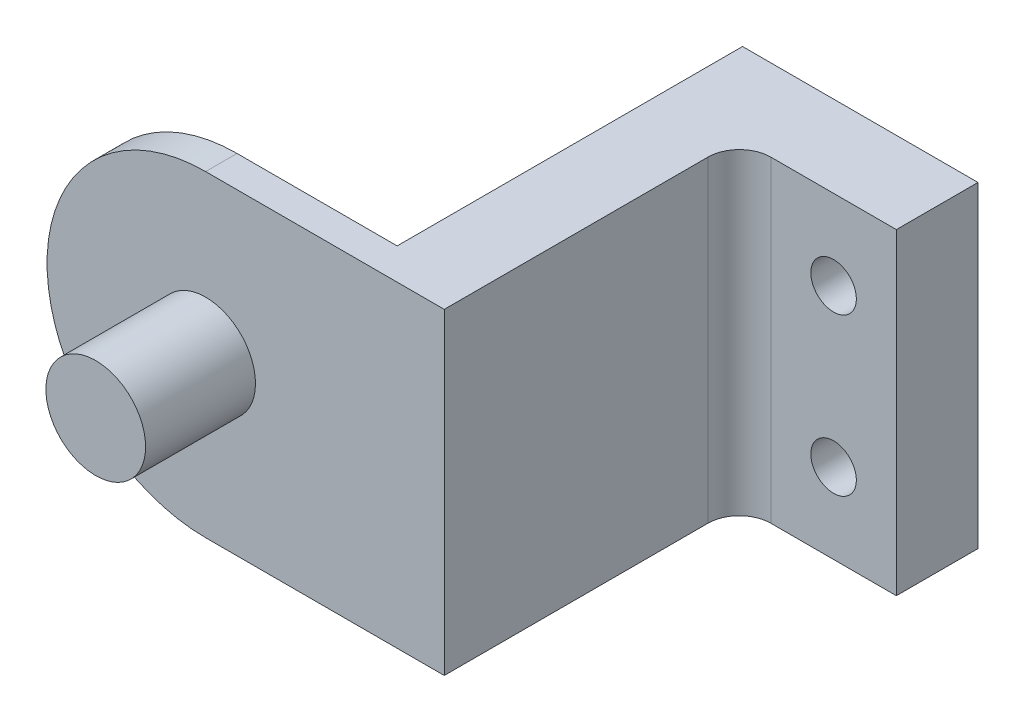
ISO-10303-21;
HEADER;
FILE_DESCRIPTION(('STEP AP214'),'2;1');
FILE_NAME('part.step','',(''),(''),'','','');
FILE_SCHEMA(('AUTOMOTIVE_DESIGN { 1 0 10303 214 1 1 1 1 }'));
ENDSEC;
DATA;
#1=APPLICATION_CONTEXT('core data for automotive mechanical design processes');
#2=APPLICATION_PROTOCOL_DEFINITION('international standard','automotive_design',2000,#1);
#3=PRODUCT_CONTEXT('',#1,'mechanical');
#4=PRODUCT('Part','Part','',(#3));
#5=PRODUCT_RELATED_PRODUCT_CATEGORY('part','',(#4));
#6=PRODUCT_DEFINITION_FORMATION('','',#4);
#7=PRODUCT_DEFINITION_CONTEXT('part definition',#1,'design');
#8=PRODUCT_DEFINITION('design','',#6,#7);
#9=PRODUCT_DEFINITION_SHAPE('','',#8);
#10=(LENGTH_UNIT() NAMED_UNIT(*) SI_UNIT(.MILLI.,.METRE.));
#11=(NAMED_UNIT(*) PLANE_ANGLE_UNIT() SI_UNIT($,.RADIAN.));
#12=(NAMED_UNIT(*) SI_UNIT($,.STERADIAN.) SOLID_ANGLE_UNIT());
#13=UNCERTAINTY_MEASURE_WITH_UNIT(LENGTH_MEASURE(1.E-05),#10,'distance_accuracy_value','');
#14=(GEOMETRIC_REPRESENTATION_CONTEXT(3) GLOBAL_UNCERTAINTY_ASSIGNED_CONTEXT((#13)) GLOBAL_UNIT_ASSIGNED_CONTEXT((#10,
#11,#12)) REPRESENTATION_CONTEXT('',''));
#15=CARTESIAN_POINT('',(0.,0.,0.));
#16=DIRECTION('',(0.,0.,1.));
#17=DIRECTION('',(1.,0.,0.));
#18=AXIS2_PLACEMENT_3D('',#15,#16,#17);
#19=CARTESIAN_POINT('',(2.5,10.1,22.));
#20=DIRECTION('',(-1.,0.,0.));
#21=DIRECTION('',(0.,-1.,0.));
#22=AXIS2_PLACEMENT_3D('',#19,#20,#21);
#23=PLANE('',#22);
#24=DIRECTION('',(0.,0.,-1.));
#25=VECTOR('',#24,1.);
#26=CARTESIAN_POINT('',(2.5,-10.1,22.));
#27=LINE('',#26,#25);
#28=CARTESIAN_POINT('',(2.5,-10.1,24.));
#29=VERTEX_POINT('',#28);
#30=CARTESIAN_POINT('',(2.5,-10.1,7.2));
#31=VERTEX_POINT('',#30);
#32=EDGE_CURVE('E197',#29,#31,#27,.T.);
#33=ORIENTED_EDGE('',*,*,#32,.T.);
#34=DIRECTION('',(0.,-1.,0.));
#35=VECTOR('',#34,1.);
#36=CARTESIAN_POINT('',(2.5,10.1,7.2));
#37=LINE('',#36,#35);
#38=CARTESIAN_POINT('',(2.5,10.1,7.2));
#39=VERTEX_POINT('',#38);
#40=EDGE_CURVE('E61',#31,#39,#37,.F.);
#41=ORIENTED_EDGE('',*,*,#40,.T.);
#42=DIRECTION('',(0.,0.,-1.));
#43=VECTOR('',#42,1.);
#44=CARTESIAN_POINT('',(2.5,10.1,22.));
#45=LINE('',#44,#43);
#46=CARTESIAN_POINT('',(2.5,10.1,24.));
#47=VERTEX_POINT('',#46);
#48=EDGE_CURVE('E213',#47,#39,#45,.T.);
#49=ORIENTED_EDGE('',*,*,#48,.F.);
#50=DIRECTION('',(0.,1.,0.));
#51=VECTOR('',#50,1.);
#52=CARTESIAN_POINT('',(2.5,10.1,24.));
#53=LINE('',#52,#51);
#54=EDGE_CURVE('E164',#29,#47,#53,.T.);
#55=ORIENTED_EDGE('',*,*,#54,.F.);
#56=EDGE_LOOP('',(#33,#41,#49,#55));
#57=FACE_BOUND('',#56,.T.);
#58=ADVANCED_FACE('F39',(#57),#23,.F.);
#59=CARTESIAN_POINT('',(-2.5,10.1,22.));
#60=DIRECTION('',(0.,-1.,0.));
#61=DIRECTION('',(0.,0.,-1.));
#62=AXIS2_PLACEMENT_3D('',#59,#60,#61);
#63=PLANE('',#62);
#64=DIRECTION('',(-1.,0.,0.));
#65=VECTOR('',#64,1.);
#66=CARTESIAN_POINT('',(-2.5,10.1,0.));
#67=LINE('',#66,#65);
#68=CARTESIAN_POINT('',(12.5,10.1,0.));
#69=VERTEX_POINT('',#68);
#70=CARTESIAN_POINT('',(-2.5,10.1,0.));
#71=VERTEX_POINT('',#70);
#72=EDGE_CURVE('E109',#69,#71,#67,.T.);
#73=ORIENTED_EDGE('',*,*,#72,.T.);
#74=DIRECTION('',(0.,0.,-1.));
#75=VECTOR('',#74,1.);
#76=CARTESIAN_POINT('',(-2.5,10.1,22.));
#77=LINE('',#76,#75);
#78=CARTESIAN_POINT('',(-2.5,10.1,22.));
#79=VERTEX_POINT('',#78);
#80=EDGE_CURVE('E210',#79,#71,#77,.T.);
#81=ORIENTED_EDGE('',*,*,#80,.F.);
#82=DIRECTION('',(-1.,0.,0.));
#83=VECTOR('',#82,1.);
#84=CARTESIAN_POINT('',(2.5,10.1,22.));
#85=LINE('',#84,#83);
#86=CARTESIAN_POINT('',(-12.7,10.1,22.));
#87=VERTEX_POINT('',#86);
#88=EDGE_CURVE('E160',#79,#87,#85,.T.);
#89=ORIENTED_EDGE('',*,*,#88,.T.);
#90=DIRECTION('',(0.,0.,-1.));
#91=VECTOR('',#90,1.);
#92=CARTESIAN_POINT('',(-12.7,10.1,24.));
#93=LINE('',#92,#91);
#94=CARTESIAN_POINT('',(-12.7,10.1,24.));
#95=VERTEX_POINT('',#94);
#96=EDGE_CURVE('E119',#95,#87,#93,.T.);
#97=ORIENTED_EDGE('',*,*,#96,.F.);
#98=DIRECTION('',(-1.,0.,0.));
#99=VECTOR('',#98,1.);
#100=CARTESIAN_POINT('',(2.5,10.1,24.));
#101=LINE('',#100,#99);
#102=EDGE_CURVE('E168',#47,#95,#101,.T.);
#103=ORIENTED_EDGE('',*,*,#102,.F.);
#104=ORIENTED_EDGE('',*,*,#48,.T.);
#105=CARTESIAN_POINT('',(4.5,10.1,7.2));
#106=DIRECTION('',(0.,-1.,0.));
#107=DIRECTION('',(0.,0.,-1.));
#108=AXIS2_PLACEMENT_3D('',#105,#106,#107);
#109=CIRCLE('',#108,2.);
#110=CARTESIAN_POINT('',(4.5,10.1,5.2));
#111=VERTEX_POINT('',#110);
#112=EDGE_CURVE('E11',#39,#111,#109,.T.);
#113=ORIENTED_EDGE('',*,*,#112,.T.);
#114=DIRECTION('',(-1.,0.,0.));
#115=VECTOR('',#114,1.);
#116=CARTESIAN_POINT('',(12.5,10.1,5.2));
#117=LINE('',#116,#115);
#118=CARTESIAN_POINT('',(12.5,10.1,5.2));
#119=VERTEX_POINT('',#118);
#120=EDGE_CURVE('E125',#119,#111,#117,.T.);
#121=ORIENTED_EDGE('',*,*,#120,.F.);
#122=DIRECTION('',(0.,0.,1.));
#123=VECTOR('',#122,1.);
#124=CARTESIAN_POINT('',(12.5,10.1,0.));
#125=LINE('',#124,#123);
#126=EDGE_CURVE('E122',#69,#119,#125,.T.);
#127=ORIENTED_EDGE('',*,*,#126,.F.);
#128=EDGE_LOOP('',(#73,#81,#89,#97,#103,#104,#113,#121,#127));
#129=FACE_BOUND('',#128,.T.);
#130=ADVANCED_FACE('F123',(#129),#63,.F.);
#131=CARTESIAN_POINT('',(-2.5,10.1,22.));
#132=DIRECTION('',(1.,0.,0.));
#133=DIRECTION('',(0.,1.,0.));
#134=AXIS2_PLACEMENT_3D('',#131,#132,#133);
#135=PLANE('',#134);
#136=DIRECTION('',(0.,-1.,0.));
#137=VECTOR('',#136,1.);
#138=CARTESIAN_POINT('',(-2.5,10.1,0.));
#139=LINE('',#138,#137);
#140=CARTESIAN_POINT('',(-2.5,-10.1,0.));
#141=VERTEX_POINT('',#140);
#142=EDGE_CURVE('E115',#71,#141,#139,.T.);
#143=ORIENTED_EDGE('',*,*,#142,.T.);
#144=DIRECTION('',(0.,0.,-1.));
#145=VECTOR('',#144,1.);
#146=CARTESIAN_POINT('',(-2.5,-10.1,22.));
#147=LINE('',#146,#145);
#148=CARTESIAN_POINT('',(-2.5,-10.1,22.));
#149=VERTEX_POINT('',#148);
#150=EDGE_CURVE('E206',#149,#141,#147,.T.);
#151=ORIENTED_EDGE('',*,*,#150,.F.);
#152=DIRECTION('',(0.,-1.,0.));
#153=VECTOR('',#152,1.);
#154=CARTESIAN_POINT('',(-2.5,10.1,22.));
#155=LINE('',#154,#153);
#156=EDGE_CURVE('E194',#79,#149,#155,.T.);
#157=ORIENTED_EDGE('',*,*,#156,.F.);
#158=ORIENTED_EDGE('',*,*,#80,.T.);
#159=EDGE_LOOP('',(#143,#151,#157,#158));
#160=FACE_BOUND('',#159,.T.);
#161=ADVANCED_FACE('F236',(#160),#135,.F.);
#162=CARTESIAN_POINT('',(-2.5,-10.1,22.));
#163=DIRECTION('',(0.,1.,0.));
#164=DIRECTION('',(0.,0.,1.));
#165=AXIS2_PLACEMENT_3D('',#162,#163,#164);
#166=PLANE('',#165);
#167=DIRECTION('',(1.,0.,0.));
#168=VECTOR('',#167,1.);
#169=CARTESIAN_POINT('',(-2.5,-10.1,0.));
#170=LINE('',#169,#168);
#171=CARTESIAN_POINT('',(12.5,-10.1,0.));
#172=VERTEX_POINT('',#171);
#173=EDGE_CURVE('E198',#141,#172,#170,.T.);
#174=ORIENTED_EDGE('',*,*,#173,.T.);
#175=DIRECTION('',(0.,0.,-1.));
#176=VECTOR('',#175,1.);
#177=CARTESIAN_POINT('',(12.5,-10.1,0.));
#178=LINE('',#177,#176);
#179=CARTESIAN_POINT('',(12.5,-10.1,5.2));
#180=VERTEX_POINT('',#179);
#181=EDGE_CURVE('E134',#180,#172,#178,.T.);
#182=ORIENTED_EDGE('',*,*,#181,.F.);
#183=DIRECTION('',(-1.,0.,0.));
#184=VECTOR('',#183,1.);
#185=CARTESIAN_POINT('',(12.5,-10.1,5.2));
#186=LINE('',#185,#184);
#187=CARTESIAN_POINT('',(4.5,-10.1,5.2));
#188=VERTEX_POINT('',#187);
#189=EDGE_CURVE('E150',#180,#188,#186,.T.);
#190=ORIENTED_EDGE('',*,*,#189,.T.);
#191=CARTESIAN_POINT('',(4.5,-10.1,7.2));
#192=DIRECTION('',(0.,1.,0.));
#193=DIRECTION('',(0.,0.,1.));
#194=AXIS2_PLACEMENT_3D('',#191,#192,#193);
#195=CIRCLE('',#194,2.);
#196=EDGE_CURVE('E48',#188,#31,#195,.T.);
#197=ORIENTED_EDGE('',*,*,#196,.T.);
#198=ORIENTED_EDGE('',*,*,#32,.F.);
#199=DIRECTION('',(1.,0.,0.));
#200=VECTOR('',#199,1.);
#201=CARTESIAN_POINT('',(2.5,-10.1,24.));
#202=LINE('',#201,#200);
#203=CARTESIAN_POINT('',(-12.7,-10.1,24.));
#204=VERTEX_POINT('',#203);
#205=EDGE_CURVE('E175',#204,#29,#202,.T.);
#206=ORIENTED_EDGE('',*,*,#205,.F.);
#207=DIRECTION('',(0.,0.,-1.));
#208=VECTOR('',#207,1.);
#209=CARTESIAN_POINT('',(-12.7,-10.1,24.));
#210=LINE('',#209,#208);
#211=CARTESIAN_POINT('',(-12.7,-10.1,22.));
#212=VERTEX_POINT('',#211);
#213=EDGE_CURVE('E179',#204,#212,#210,.T.);
#214=ORIENTED_EDGE('',*,*,#213,.T.);
#215=DIRECTION('',(1.,0.,0.));
#216=VECTOR('',#215,1.);
#217=CARTESIAN_POINT('',(2.5,-10.1,22.));
#218=LINE('',#217,#216);
#219=EDGE_CURVE('E169',#212,#149,#218,.T.);
#220=ORIENTED_EDGE('',*,*,#219,.T.);
#221=ORIENTED_EDGE('',*,*,#150,.T.);
#222=EDGE_LOOP('',(#174,#182,#190,#197,#198,#206,#214,#220,#221));
#223=FACE_BOUND('',#222,.T.);
#224=ADVANCED_FACE('F232',(#223),#166,.F.);
#225=CARTESIAN_POINT('',(0.,0.,0.));
#226=DIRECTION('',(0.,0.,1.));
#227=DIRECTION('',(1.,0.,0.));
#228=AXIS2_PLACEMENT_3D('',#225,#226,#227);
#229=PLANE('',#228);
#230=CARTESIAN_POINT('',(8.50000000000002,-5.,0.));
#231=DIRECTION('',(0.,0.,-1.));
#232=DIRECTION('',(-1.,0.,0.));
#233=AXIS2_PLACEMENT_3D('',#230,#231,#232);
#234=CIRCLE('',#233,1.45);
#235=CARTESIAN_POINT('',(7.05000000000002,-5.,0.));
#236=VERTEX_POINT('',#235);
#237=EDGE_CURVE('E219',#236,#236,#234,.T.);
#238=ORIENTED_EDGE('',*,*,#237,.F.);
#239=EDGE_LOOP('',(#238));
#240=FACE_BOUND('',#239,.T.);
#241=CARTESIAN_POINT('',(8.50000000000005,5.,0.));
#242=DIRECTION('',(0.,0.,-1.));
#243=DIRECTION('',(-1.,0.,0.));
#244=AXIS2_PLACEMENT_3D('',#241,#242,#243);
#245=CIRCLE('',#244,1.45);
#246=CARTESIAN_POINT('',(7.05000000000005,5.,0.));
#247=VERTEX_POINT('',#246);
#248=EDGE_CURVE('E143',#247,#247,#245,.T.);
#249=ORIENTED_EDGE('',*,*,#248,.F.);
#250=EDGE_LOOP('',(#249));
#251=FACE_BOUND('',#250,.T.);
#252=ORIENTED_EDGE('',*,*,#72,.F.);
#253=DIRECTION('',(0.,1.,0.));
#254=VECTOR('',#253,1.);
#255=CARTESIAN_POINT('',(12.5,-10.1,0.));
#256=LINE('',#255,#254);
#257=EDGE_CURVE('E114',#172,#69,#256,.T.);
#258=ORIENTED_EDGE('',*,*,#257,.F.);
#259=ORIENTED_EDGE('',*,*,#173,.F.);
#260=ORIENTED_EDGE('',*,*,#142,.F.);
#261=EDGE_LOOP('',(#252,#258,#259,#260));
#262=FACE_BOUND('',#261,.T.);
#263=ADVANCED_FACE('F111',(#240,#251,#262),#229,.F.);
#264=CARTESIAN_POINT('',(-12.7,0.,22.));
#265=DIRECTION('',(0.,0.,1.));
#266=DIRECTION('',(1.,0.,0.));
#267=AXIS2_PLACEMENT_3D('',#264,#265,#266);
#268=PLANE('',#267);
#269=ORIENTED_EDGE('',*,*,#88,.F.);
#270=ORIENTED_EDGE('',*,*,#156,.T.);
#271=ORIENTED_EDGE('',*,*,#219,.F.);
#272=CARTESIAN_POINT('',(-12.7,0.,22.));
#273=DIRECTION('',(0.,0.,1.));
#274=DIRECTION('',(1.,0.,0.));
#275=AXIS2_PLACEMENT_3D('',#272,#273,#274);
#276=CIRCLE('',#275,10.1);
#277=EDGE_CURVE('E182',#87,#212,#276,.T.);
#278=ORIENTED_EDGE('',*,*,#277,.F.);
#279=EDGE_LOOP('',(#269,#270,#271,#278));
#280=FACE_BOUND('',#279,.T.);
#281=ADVANCED_FACE('F239',(#280),#268,.F.);
#282=CARTESIAN_POINT('',(-12.7,0.,24.));
#283=DIRECTION('',(0.,0.,-1.));
#284=DIRECTION('',(-1.,0.,0.));
#285=AXIS2_PLACEMENT_3D('',#282,#283,#284);
#286=CYLINDRICAL_SURFACE('',#285,10.1);
#287=ORIENTED_EDGE('',*,*,#277,.T.);
#288=ORIENTED_EDGE('',*,*,#213,.F.);
#289=CARTESIAN_POINT('',(-12.7,0.,24.));
#290=DIRECTION('',(0.,0.,1.));
#291=DIRECTION('',(1.,0.,0.));
#292=AXIS2_PLACEMENT_3D('',#289,#290,#291);
#293=CIRCLE('',#292,10.1);
#294=EDGE_CURVE('E172',#95,#204,#293,.T.);
#295=ORIENTED_EDGE('',*,*,#294,.F.);
#296=ORIENTED_EDGE('',*,*,#96,.T.);
#297=EDGE_LOOP('',(#287,#288,#295,#296));
#298=FACE_BOUND('',#297,.T.);
#299=ADVANCED_FACE('F245',(#298),#286,.T.);
#300=CARTESIAN_POINT('',(-12.7,0.,24.));
#301=DIRECTION('',(0.,0.,1.));
#302=DIRECTION('',(1.,0.,0.));
#303=AXIS2_PLACEMENT_3D('',#300,#301,#302);
#304=PLANE('',#303);
#305=CARTESIAN_POINT('',(-12.7,0.,24.));
#306=DIRECTION('',(0.,0.,1.));
#307=DIRECTION('',(1.,0.,0.));
#308=AXIS2_PLACEMENT_3D('',#305,#306,#307);
#309=CIRCLE('',#308,3.175);
#310=CARTESIAN_POINT('',(-9.525,0.,24.));
#311=VERTEX_POINT('',#310);
#312=EDGE_CURVE('E155',#311,#311,#309,.T.);
#313=ORIENTED_EDGE('',*,*,#312,.F.);
#314=EDGE_LOOP('',(#313));
#315=FACE_BOUND('',#314,.T.);
#316=ORIENTED_EDGE('',*,*,#54,.T.);
#317=ORIENTED_EDGE('',*,*,#102,.T.);
#318=ORIENTED_EDGE('',*,*,#294,.T.);
#319=ORIENTED_EDGE('',*,*,#205,.T.);
#320=EDGE_LOOP('',(#316,#317,#318,#319));
#321=FACE_BOUND('',#320,.T.);
#322=ADVANCED_FACE('F249',(#315,#321),#304,.T.);
#323=CARTESIAN_POINT('',(-12.7,0.,31.));
#324=DIRECTION('',(0.,0.,-1.));
#325=DIRECTION('',(-1.,0.,0.));
#326=AXIS2_PLACEMENT_3D('',#323,#324,#325);
#327=CYLINDRICAL_SURFACE('',#326,3.175);
#328=CARTESIAN_POINT('',(-12.7,0.,31.));
#329=DIRECTION('',(0.,0.,1.));
#330=DIRECTION('',(1.,0.,0.));
#331=AXIS2_PLACEMENT_3D('',#328,#329,#330);
#332=CIRCLE('',#331,3.175);
#333=CARTESIAN_POINT('',(-9.525,0.,31.));
#334=VERTEX_POINT('',#333);
#335=EDGE_CURVE('E156',#334,#334,#332,.T.);
#336=ORIENTED_EDGE('',*,*,#335,.F.);
#337=EDGE_LOOP('',(#336));
#338=FACE_BOUND('',#337,.T.);
#339=ORIENTED_EDGE('',*,*,#312,.T.);
#340=EDGE_LOOP('',(#339));
#341=FACE_BOUND('',#340,.T.);
#342=ADVANCED_FACE('F278',(#338,#341),#327,.T.);
#343=CARTESIAN_POINT('',(-12.7,0.,31.));
#344=DIRECTION('',(0.,0.,1.));
#345=DIRECTION('',(1.,0.,0.));
#346=AXIS2_PLACEMENT_3D('',#343,#344,#345);
#347=PLANE('',#346);
#348=ORIENTED_EDGE('',*,*,#335,.T.);
#349=EDGE_LOOP('',(#348));
#350=FACE_BOUND('',#349,.T.);
#351=ADVANCED_FACE('F282',(#350),#347,.T.);
#352=CARTESIAN_POINT('',(12.5,-10.1,5.2));
#353=DIRECTION('',(0.,0.,-1.));
#354=DIRECTION('',(-1.,0.,0.));
#355=AXIS2_PLACEMENT_3D('',#352,#353,#354);
#356=PLANE('',#355);
#357=CARTESIAN_POINT('',(8.50000000000002,-5.,5.2));
#358=DIRECTION('',(0.,0.,-1.));
#359=DIRECTION('',(-1.,0.,0.));
#360=AXIS2_PLACEMENT_3D('',#357,#358,#359);
#361=CIRCLE('',#360,1.45);
#362=CARTESIAN_POINT('',(7.05000000000002,-5.,5.2));
#363=VERTEX_POINT('',#362);
#364=EDGE_CURVE('E136',#363,#363,#361,.T.);
#365=ORIENTED_EDGE('',*,*,#364,.T.);
#366=EDGE_LOOP('',(#365));
#367=FACE_BOUND('',#366,.T.);
#368=CARTESIAN_POINT('',(8.50000000000005,5.,5.2));
#369=DIRECTION('',(0.,0.,-1.));
#370=DIRECTION('',(-1.,0.,0.));
#371=AXIS2_PLACEMENT_3D('',#368,#369,#370);
#372=CIRCLE('',#371,1.45);
#373=CARTESIAN_POINT('',(7.05000000000005,5.,5.2));
#374=VERTEX_POINT('',#373);
#375=EDGE_CURVE('E140',#374,#374,#372,.T.);
#376=ORIENTED_EDGE('',*,*,#375,.T.);
#377=EDGE_LOOP('',(#376));
#378=FACE_BOUND('',#377,.T.);
#379=ORIENTED_EDGE('',*,*,#120,.T.);
#380=DIRECTION('',(0.,-1.,0.));
#381=VECTOR('',#380,1.);
#382=CARTESIAN_POINT('',(4.5,-10.1,5.2));
#383=LINE('',#382,#381);
#384=EDGE_CURVE('E216',#111,#188,#383,.T.);
#385=ORIENTED_EDGE('',*,*,#384,.T.);
#386=ORIENTED_EDGE('',*,*,#189,.F.);
#387=DIRECTION('',(0.,-1.,0.));
#388=VECTOR('',#387,1.);
#389=CARTESIAN_POINT('',(12.5,-10.1,5.2));
#390=LINE('',#389,#388);
#391=EDGE_CURVE('E129',#119,#180,#390,.T.);
#392=ORIENTED_EDGE('',*,*,#391,.F.);
#393=EDGE_LOOP('',(#379,#385,#386,#392));
#394=FACE_BOUND('',#393,.T.);
#395=ADVANCED_FACE('F229',(#367,#378,#394),#356,.F.);
#396=CARTESIAN_POINT('',(12.5,0.,0.));
#397=DIRECTION('',(1.,0.,0.));
#398=DIRECTION('',(0.,1.,0.));
#399=AXIS2_PLACEMENT_3D('',#396,#397,#398);
#400=PLANE('',#399);
#401=ORIENTED_EDGE('',*,*,#257,.T.);
#402=ORIENTED_EDGE('',*,*,#126,.T.);
#403=ORIENTED_EDGE('',*,*,#391,.T.);
#404=ORIENTED_EDGE('',*,*,#181,.T.);
#405=EDGE_LOOP('',(#401,#402,#403,#404));
#406=FACE_BOUND('',#405,.T.);
#407=ADVANCED_FACE('F132',(#406),#400,.T.);
#408=CARTESIAN_POINT('',(8.50000000000005,5.,31.));
#409=DIRECTION('',(0.,0.,-1.));
#410=DIRECTION('',(-1.,0.,0.));
#411=AXIS2_PLACEMENT_3D('',#408,#409,#410);
#412=CYLINDRICAL_SURFACE('',#411,1.45);
#413=ORIENTED_EDGE('',*,*,#248,.T.);
#414=EDGE_LOOP('',(#413));
#415=FACE_BOUND('',#414,.T.);
#416=ORIENTED_EDGE('',*,*,#375,.F.);
#417=EDGE_LOOP('',(#416));
#418=FACE_BOUND('',#417,.T.);
#419=ADVANCED_FACE('F256',(#415,#418),#412,.F.);
#420=CARTESIAN_POINT('',(8.50000000000002,-5.,31.));
#421=DIRECTION('',(0.,0.,-1.));
#422=DIRECTION('',(-1.,0.,0.));
#423=AXIS2_PLACEMENT_3D('',#420,#421,#422);
#424=CYLINDRICAL_SURFACE('',#423,1.45);
#425=ORIENTED_EDGE('',*,*,#237,.T.);
#426=EDGE_LOOP('',(#425));
#427=FACE_BOUND('',#426,.T.);
#428=ORIENTED_EDGE('',*,*,#364,.F.);
#429=EDGE_LOOP('',(#428));
#430=FACE_BOUND('',#429,.T.);
#431=ADVANCED_FACE('F252',(#427,#430),#424,.F.);
#432=CARTESIAN_POINT('',(4.5,-10.1,7.2));
#433=DIRECTION('',(0.,1.,0.));
#434=DIRECTION('',(-1.,0.,0.));
#435=AXIS2_PLACEMENT_3D('',#432,#433,#434);
#436=CYLINDRICAL_SURFACE('',#435,2.);
#437=ORIENTED_EDGE('',*,*,#112,.F.);
#438=ORIENTED_EDGE('',*,*,#40,.F.);
#439=ORIENTED_EDGE('',*,*,#196,.F.);
#440=ORIENTED_EDGE('',*,*,#384,.F.);
#441=EDGE_LOOP('',(#437,#438,#439,#440));
#442=FACE_BOUND('',#441,.T.);
#443=ADVANCED_FACE('F41',(#442),#436,.F.);
#444=CLOSED_SHELL('',(#58,#130,#161,#224,#263,#281,#299,#322,#342,#351,#395,#407,#419,#431,#443));
#445=MANIFOLD_SOLID_BREP('B2',#444);
#446=ADVANCED_BREP_SHAPE_REPRESENTATION('',(#18,#445),#14);
#447=SHAPE_DEFINITION_REPRESENTATION(#9,#446);
ENDSEC;
END-ISO-10303-21;
